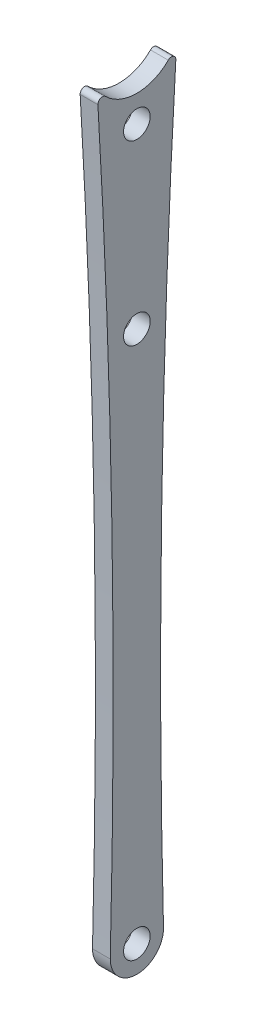
ISO-10303-21;
HEADER;
FILE_DESCRIPTION(('STEP AP214'),'2;1');
FILE_NAME('part.step','',(''),(''),'','','');
FILE_SCHEMA(('AUTOMOTIVE_DESIGN { 1 0 10303 214 1 1 1 1 }'));
ENDSEC;
DATA;
#1=APPLICATION_CONTEXT('core data for automotive mechanical design processes');
#2=APPLICATION_PROTOCOL_DEFINITION('international standard','automotive_design',2000,#1);
#3=PRODUCT_CONTEXT('',#1,'mechanical');
#4=PRODUCT('Part','Part','',(#3));
#5=PRODUCT_RELATED_PRODUCT_CATEGORY('part','',(#4));
#6=PRODUCT_DEFINITION_FORMATION('','',#4);
#7=PRODUCT_DEFINITION_CONTEXT('part definition',#1,'design');
#8=PRODUCT_DEFINITION('design','',#6,#7);
#9=PRODUCT_DEFINITION_SHAPE('','',#8);
#10=(LENGTH_UNIT() NAMED_UNIT(*) SI_UNIT(.MILLI.,.METRE.));
#11=(NAMED_UNIT(*) PLANE_ANGLE_UNIT() SI_UNIT($,.RADIAN.));
#12=(NAMED_UNIT(*) SI_UNIT($,.STERADIAN.) SOLID_ANGLE_UNIT());
#13=UNCERTAINTY_MEASURE_WITH_UNIT(LENGTH_MEASURE(1.E-05),#10,'distance_accuracy_value','');
#14=(GEOMETRIC_REPRESENTATION_CONTEXT(3) GLOBAL_UNCERTAINTY_ASSIGNED_CONTEXT((#13)) GLOBAL_UNIT_ASSIGNED_CONTEXT((#10,
#11,#12)) REPRESENTATION_CONTEXT('',''));
#15=CARTESIAN_POINT('',(0.,0.,0.));
#16=DIRECTION('',(0.,0.,1.));
#17=DIRECTION('',(1.,0.,0.));
#18=AXIS2_PLACEMENT_3D('',#15,#16,#17);
#19=CARTESIAN_POINT('',(2.,54.8167427479074,-503.282905762661));
#20=DIRECTION('',(-1.,0.,0.));
#21=DIRECTION('',(0.,0.,1.));
#22=AXIS2_PLACEMENT_3D('',#19,#20,#21);
#23=PLANE('',#22);
#24=CARTESIAN_POINT('',(2.,25.5201548711849,-1002.67430780997));
#25=DIRECTION('',(-1.,0.,0.));
#26=DIRECTION('',(0.,0.,1.));
#27=AXIS2_PLACEMENT_3D('',#24,#25,#26);
#28=CIRCLE('',#27,1000.);
#29=CARTESIAN_POINT('',(2.,0.,-3.00000000000022));
#30=VERTEX_POINT('',#29);
#31=CARTESIAN_POINT('',(2.,84.0840486777267,-4.39064554647894));
#32=VERTEX_POINT('',#31);
#33=EDGE_CURVE('E155',#30,#32,#28,.T.);
#34=ORIENTED_EDGE('',*,*,#33,.T.);
#35=CARTESIAN_POINT('',(2.,84.11333062463,-3.89150371534719));
#36=DIRECTION('',(1.,0.,0.));
#37=DIRECTION('',(0.,0.,-1.));
#38=AXIS2_PLACEMENT_3D('',#35,#36,#37);
#39=CIRCLE('',#38,0.499999999999999);
#40=CARTESIAN_POINT('',(2.,84.4666642042091,-3.53773065031563));
#41=VERTEX_POINT('',#40);
#42=EDGE_CURVE('E99',#32,#41,#39,.T.);
#43=ORIENTED_EDGE('',*,*,#42,.T.);
#44=CARTESIAN_POINT('',(2.,88.,0.));
#45=DIRECTION('',(-1.,0.,0.));
#46=DIRECTION('',(0.,0.,1.));
#47=AXIS2_PLACEMENT_3D('',#44,#45,#46);
#48=CIRCLE('',#47,5.00000000000001);
#49=CARTESIAN_POINT('',(2.,84.4666642042093,3.53773065031585));
#50=VERTEX_POINT('',#49);
#51=EDGE_CURVE('E114',#41,#50,#48,.T.);
#52=ORIENTED_EDGE('',*,*,#51,.T.);
#53=CARTESIAN_POINT('',(2.,84.11333062463,3.89150371534719));
#54=DIRECTION('',(1.,0.,0.));
#55=DIRECTION('',(0.,0.,1.));
#56=AXIS2_PLACEMENT_3D('',#53,#54,#55);
#57=CIRCLE('',#56,0.499999999999999);
#58=CARTESIAN_POINT('',(2.,84.0840486777263,4.39064554647906));
#59=VERTEX_POINT('',#58);
#60=EDGE_CURVE('E110',#50,#59,#57,.T.);
#61=ORIENTED_EDGE('',*,*,#60,.T.);
#62=CARTESIAN_POINT('',(2.,25.5201548711849,1002.67430780997));
#63=DIRECTION('',(-1.,0.,0.));
#64=DIRECTION('',(0.,0.,-1.));
#65=AXIS2_PLACEMENT_3D('',#62,#63,#64);
#66=CIRCLE('',#65,1000.);
#67=CARTESIAN_POINT('',(2.,0.,3.00000000000022));
#68=VERTEX_POINT('',#67);
#69=EDGE_CURVE('E112',#59,#68,#66,.T.);
#70=ORIENTED_EDGE('',*,*,#69,.T.);
#71=CARTESIAN_POINT('',(2.,0.,0.));
#72=DIRECTION('',(1.,0.,0.));
#73=DIRECTION('',(0.,0.,-1.));
#74=AXIS2_PLACEMENT_3D('',#71,#72,#73);
#75=CIRCLE('',#74,3.00000000000022);
#76=EDGE_CURVE('E62',#68,#30,#75,.T.);
#77=ORIENTED_EDGE('',*,*,#76,.T.);
#78=EDGE_LOOP('',(#34,#43,#52,#61,#70,#77));
#79=FACE_BOUND('',#78,.T.);
#80=CARTESIAN_POINT('',(2.,0.,0.));
#81=DIRECTION('',(1.,0.,0.));
#82=DIRECTION('',(0.,0.,-1.));
#83=AXIS2_PLACEMENT_3D('',#80,#81,#82);
#84=CIRCLE('',#83,1.5);
#85=CARTESIAN_POINT('',(2.,0.,-1.5));
#86=VERTEX_POINT('',#85);
#87=EDGE_CURVE('E138',#86,#86,#84,.T.);
#88=ORIENTED_EDGE('',*,*,#87,.F.);
#89=EDGE_LOOP('',(#88));
#90=FACE_BOUND('',#89,.T.);
#91=CARTESIAN_POINT('',(2.,60.,0.));
#92=DIRECTION('',(1.,0.,0.));
#93=DIRECTION('',(0.,0.,-1.));
#94=AXIS2_PLACEMENT_3D('',#91,#92,#93);
#95=CIRCLE('',#94,1.5);
#96=CARTESIAN_POINT('',(2.,60.,-1.5));
#97=VERTEX_POINT('',#96);
#98=EDGE_CURVE('E215',#97,#97,#95,.T.);
#99=ORIENTED_EDGE('',*,*,#98,.F.);
#100=EDGE_LOOP('',(#99));
#101=FACE_BOUND('',#100,.T.);
#102=CARTESIAN_POINT('',(2.,80.,0.));
#103=DIRECTION('',(1.,0.,0.));
#104=DIRECTION('',(0.,0.,-1.));
#105=AXIS2_PLACEMENT_3D('',#102,#103,#104);
#106=CIRCLE('',#105,1.5);
#107=CARTESIAN_POINT('',(2.,80.,-1.5));
#108=VERTEX_POINT('',#107);
#109=EDGE_CURVE('E203',#108,#108,#106,.T.);
#110=ORIENTED_EDGE('',*,*,#109,.F.);
#111=EDGE_LOOP('',(#110));
#112=FACE_BOUND('',#111,.T.);
#113=ADVANCED_FACE('F44',(#79,#90,#101,#112),#23,.F.);
#114=CARTESIAN_POINT('',(0.,54.8167427479074,-503.282905762661));
#115=DIRECTION('',(-1.,0.,0.));
#116=DIRECTION('',(0.,0.,1.));
#117=AXIS2_PLACEMENT_3D('',#114,#115,#116);
#118=PLANE('',#117);
#119=CARTESIAN_POINT('',(0.,60.,0.));
#120=DIRECTION('',(1.,0.,0.));
#121=DIRECTION('',(0.,0.,-1.));
#122=AXIS2_PLACEMENT_3D('',#119,#120,#121);
#123=CIRCLE('',#122,1.5);
#124=CARTESIAN_POINT('',(0.,60.,-1.5));
#125=VERTEX_POINT('',#124);
#126=EDGE_CURVE('E207',#125,#125,#123,.T.);
#127=ORIENTED_EDGE('',*,*,#126,.T.);
#128=EDGE_LOOP('',(#127));
#129=FACE_BOUND('',#128,.T.);
#130=CARTESIAN_POINT('',(0.,25.5201548711849,-1002.67430780997));
#131=DIRECTION('',(-1.,0.,0.));
#132=DIRECTION('',(0.,0.,1.));
#133=AXIS2_PLACEMENT_3D('',#130,#131,#132);
#134=CIRCLE('',#133,1000.);
#135=CARTESIAN_POINT('',(0.,0.,-3.00000000000022));
#136=VERTEX_POINT('',#135);
#137=CARTESIAN_POINT('',(0.,84.0840486777267,-4.39064554647894));
#138=VERTEX_POINT('',#137);
#139=EDGE_CURVE('E134',#136,#138,#134,.T.);
#140=ORIENTED_EDGE('',*,*,#139,.F.);
#141=CARTESIAN_POINT('',(0.,0.,0.));
#142=DIRECTION('',(1.,0.,0.));
#143=DIRECTION('',(0.,0.,-1.));
#144=AXIS2_PLACEMENT_3D('',#141,#142,#143);
#145=CIRCLE('',#144,3.00000000000022);
#146=CARTESIAN_POINT('',(0.,0.,3.00000000000022));
#147=VERTEX_POINT('',#146);
#148=EDGE_CURVE('E95',#147,#136,#145,.T.);
#149=ORIENTED_EDGE('',*,*,#148,.F.);
#150=CARTESIAN_POINT('',(0.,25.5201548711849,1002.67430780997));
#151=DIRECTION('',(-1.,0.,0.));
#152=DIRECTION('',(0.,0.,-1.));
#153=AXIS2_PLACEMENT_3D('',#150,#151,#152);
#154=CIRCLE('',#153,1000.);
#155=CARTESIAN_POINT('',(0.,84.0840486777263,4.39064554647906));
#156=VERTEX_POINT('',#155);
#157=EDGE_CURVE('E88',#156,#147,#154,.T.);
#158=ORIENTED_EDGE('',*,*,#157,.F.);
#159=CARTESIAN_POINT('',(0.,84.11333062463,3.89150371534719));
#160=DIRECTION('',(1.,0.,0.));
#161=DIRECTION('',(0.,0.,1.));
#162=AXIS2_PLACEMENT_3D('',#159,#160,#161);
#163=CIRCLE('',#162,0.499999999999999);
#164=CARTESIAN_POINT('',(0.,84.4666642042093,3.53773065031585));
#165=VERTEX_POINT('',#164);
#166=EDGE_CURVE('E124',#165,#156,#163,.T.);
#167=ORIENTED_EDGE('',*,*,#166,.F.);
#168=CARTESIAN_POINT('',(0.,88.,0.));
#169=DIRECTION('',(-1.,0.,0.));
#170=DIRECTION('',(0.,0.,1.));
#171=AXIS2_PLACEMENT_3D('',#168,#169,#170);
#172=CIRCLE('',#171,5.00000000000001);
#173=CARTESIAN_POINT('',(0.,84.4666642042091,-3.53773065031563));
#174=VERTEX_POINT('',#173);
#175=EDGE_CURVE('E141',#174,#165,#172,.T.);
#176=ORIENTED_EDGE('',*,*,#175,.F.);
#177=CARTESIAN_POINT('',(0.,84.11333062463,-3.89150371534719));
#178=DIRECTION('',(1.,0.,0.));
#179=DIRECTION('',(0.,0.,-1.));
#180=AXIS2_PLACEMENT_3D('',#177,#178,#179);
#181=CIRCLE('',#180,0.499999999999999);
#182=EDGE_CURVE('E136',#138,#174,#181,.T.);
#183=ORIENTED_EDGE('',*,*,#182,.F.);
#184=EDGE_LOOP('',(#140,#149,#158,#167,#176,#183));
#185=FACE_BOUND('',#184,.T.);
#186=CARTESIAN_POINT('',(0.,0.,0.));
#187=DIRECTION('',(1.,0.,0.));
#188=DIRECTION('',(0.,0.,-1.));
#189=AXIS2_PLACEMENT_3D('',#186,#187,#188);
#190=CIRCLE('',#189,1.5);
#191=CARTESIAN_POINT('',(0.,0.,-1.5));
#192=VERTEX_POINT('',#191);
#193=EDGE_CURVE('E216',#192,#192,#190,.T.);
#194=ORIENTED_EDGE('',*,*,#193,.T.);
#195=EDGE_LOOP('',(#194));
#196=FACE_BOUND('',#195,.T.);
#197=CARTESIAN_POINT('',(0.,80.,0.));
#198=DIRECTION('',(1.,0.,0.));
#199=DIRECTION('',(0.,0.,-1.));
#200=AXIS2_PLACEMENT_3D('',#197,#198,#199);
#201=CIRCLE('',#200,1.5);
#202=CARTESIAN_POINT('',(0.,80.,-1.5));
#203=VERTEX_POINT('',#202);
#204=EDGE_CURVE('E204',#203,#203,#201,.T.);
#205=ORIENTED_EDGE('',*,*,#204,.T.);
#206=EDGE_LOOP('',(#205));
#207=FACE_BOUND('',#206,.T.);
#208=ADVANCED_FACE('F164',(#129,#185,#196,#207),#118,.T.);
#209=CARTESIAN_POINT('',(2.,25.5201548711849,-1002.67430780997));
#210=DIRECTION('',(-1.,0.,0.));
#211=DIRECTION('',(0.,0.,1.));
#212=AXIS2_PLACEMENT_3D('',#209,#210,#211);
#213=CYLINDRICAL_SURFACE('',#212,1000.);
#214=ORIENTED_EDGE('',*,*,#139,.T.);
#215=DIRECTION('',(-1.,0.,0.));
#216=VECTOR('',#215,1.);
#217=CARTESIAN_POINT('',(2.,84.0840486777267,-4.39064554647894));
#218=LINE('',#217,#216);
#219=EDGE_CURVE('E11',#32,#138,#218,.T.);
#220=ORIENTED_EDGE('',*,*,#219,.F.);
#221=ORIENTED_EDGE('',*,*,#33,.F.);
#222=DIRECTION('',(-1.,0.,0.));
#223=VECTOR('',#222,1.);
#224=CARTESIAN_POINT('',(2.,0.,-3.00000000000022));
#225=LINE('',#224,#223);
#226=EDGE_CURVE('E131',#30,#136,#225,.T.);
#227=ORIENTED_EDGE('',*,*,#226,.T.);
#228=EDGE_LOOP('',(#214,#220,#221,#227));
#229=FACE_BOUND('',#228,.T.);
#230=ADVANCED_FACE('F50',(#229),#213,.F.);
#231=CARTESIAN_POINT('',(2.,84.11333062463,-3.89150371534719));
#232=DIRECTION('',(-1.,0.,0.));
#233=DIRECTION('',(0.,0.,1.));
#234=AXIS2_PLACEMENT_3D('',#231,#232,#233);
#235=CYLINDRICAL_SURFACE('',#234,0.499999999999999);
#236=ORIENTED_EDGE('',*,*,#182,.T.);
#237=DIRECTION('',(-1.,0.,0.));
#238=VECTOR('',#237,1.);
#239=CARTESIAN_POINT('',(2.,84.4666642042091,-3.53773065031563));
#240=LINE('',#239,#238);
#241=EDGE_CURVE('E54',#41,#174,#240,.T.);
#242=ORIENTED_EDGE('',*,*,#241,.F.);
#243=ORIENTED_EDGE('',*,*,#42,.F.);
#244=ORIENTED_EDGE('',*,*,#219,.T.);
#245=EDGE_LOOP('',(#236,#242,#243,#244));
#246=FACE_BOUND('',#245,.T.);
#247=ADVANCED_FACE('F277',(#246),#235,.T.);
#248=CARTESIAN_POINT('',(2.,88.,0.));
#249=DIRECTION('',(-1.,0.,0.));
#250=DIRECTION('',(0.,0.,1.));
#251=AXIS2_PLACEMENT_3D('',#248,#249,#250);
#252=CYLINDRICAL_SURFACE('',#251,5.00000000000001);
#253=ORIENTED_EDGE('',*,*,#175,.T.);
#254=DIRECTION('',(-1.,0.,0.));
#255=VECTOR('',#254,1.);
#256=CARTESIAN_POINT('',(2.,84.4666642042093,3.53773065031585));
#257=LINE('',#256,#255);
#258=EDGE_CURVE('E121',#50,#165,#257,.T.);
#259=ORIENTED_EDGE('',*,*,#258,.F.);
#260=ORIENTED_EDGE('',*,*,#51,.F.);
#261=ORIENTED_EDGE('',*,*,#241,.T.);
#262=EDGE_LOOP('',(#253,#259,#260,#261));
#263=FACE_BOUND('',#262,.T.);
#264=ADVANCED_FACE('F165',(#263),#252,.F.);
#265=CARTESIAN_POINT('',(2.,84.11333062463,3.89150371534719));
#266=DIRECTION('',(-1.,0.,0.));
#267=DIRECTION('',(0.,0.,1.));
#268=AXIS2_PLACEMENT_3D('',#265,#266,#267);
#269=CYLINDRICAL_SURFACE('',#268,0.499999999999999);
#270=ORIENTED_EDGE('',*,*,#166,.T.);
#271=DIRECTION('',(-1.,0.,0.));
#272=VECTOR('',#271,1.);
#273=CARTESIAN_POINT('',(2.,84.0840486777263,4.39064554647906));
#274=LINE('',#273,#272);
#275=EDGE_CURVE('E118',#59,#156,#274,.T.);
#276=ORIENTED_EDGE('',*,*,#275,.F.);
#277=ORIENTED_EDGE('',*,*,#60,.F.);
#278=ORIENTED_EDGE('',*,*,#258,.T.);
#279=EDGE_LOOP('',(#270,#276,#277,#278));
#280=FACE_BOUND('',#279,.T.);
#281=ADVANCED_FACE('F119',(#280),#269,.T.);
#282=CARTESIAN_POINT('',(2.,25.5201548711849,1002.67430780997));
#283=DIRECTION('',(-1.,0.,0.));
#284=DIRECTION('',(0.,0.,1.));
#285=AXIS2_PLACEMENT_3D('',#282,#283,#284);
#286=CYLINDRICAL_SURFACE('',#285,1000.);
#287=ORIENTED_EDGE('',*,*,#157,.T.);
#288=DIRECTION('',(-1.,0.,0.));
#289=VECTOR('',#288,1.);
#290=CARTESIAN_POINT('',(2.,0.,3.00000000000022));
#291=LINE('',#290,#289);
#292=EDGE_CURVE('E123',#68,#147,#291,.T.);
#293=ORIENTED_EDGE('',*,*,#292,.F.);
#294=ORIENTED_EDGE('',*,*,#69,.F.);
#295=ORIENTED_EDGE('',*,*,#275,.T.);
#296=EDGE_LOOP('',(#287,#293,#294,#295));
#297=FACE_BOUND('',#296,.T.);
#298=ADVANCED_FACE('F130',(#297),#286,.F.);
#299=CARTESIAN_POINT('',(2.,0.,0.));
#300=DIRECTION('',(-1.,0.,0.));
#301=DIRECTION('',(0.,0.,1.));
#302=AXIS2_PLACEMENT_3D('',#299,#300,#301);
#303=CYLINDRICAL_SURFACE('',#302,3.00000000000022);
#304=ORIENTED_EDGE('',*,*,#148,.T.);
#305=ORIENTED_EDGE('',*,*,#226,.F.);
#306=ORIENTED_EDGE('',*,*,#76,.F.);
#307=ORIENTED_EDGE('',*,*,#292,.T.);
#308=EDGE_LOOP('',(#304,#305,#306,#307));
#309=FACE_BOUND('',#308,.T.);
#310=ADVANCED_FACE('F168',(#309),#303,.T.);
#311=CARTESIAN_POINT('',(2.,0.,0.));
#312=DIRECTION('',(-1.,0.,0.));
#313=DIRECTION('',(0.,0.,1.));
#314=AXIS2_PLACEMENT_3D('',#311,#312,#313);
#315=CYLINDRICAL_SURFACE('',#314,1.5);
#316=ORIENTED_EDGE('',*,*,#87,.T.);
#317=EDGE_LOOP('',(#316));
#318=FACE_BOUND('',#317,.T.);
#319=ORIENTED_EDGE('',*,*,#193,.F.);
#320=EDGE_LOOP('',(#319));
#321=FACE_BOUND('',#320,.T.);
#322=ADVANCED_FACE('F175',(#318,#321),#315,.F.);
#323=CARTESIAN_POINT('',(2.,60.,0.));
#324=DIRECTION('',(-1.,0.,0.));
#325=DIRECTION('',(0.,0.,1.));
#326=AXIS2_PLACEMENT_3D('',#323,#324,#325);
#327=CYLINDRICAL_SURFACE('',#326,1.5);
#328=ORIENTED_EDGE('',*,*,#98,.T.);
#329=EDGE_LOOP('',(#328));
#330=FACE_BOUND('',#329,.T.);
#331=ORIENTED_EDGE('',*,*,#126,.F.);
#332=EDGE_LOOP('',(#331));
#333=FACE_BOUND('',#332,.T.);
#334=ADVANCED_FACE('F180',(#330,#333),#327,.F.);
#335=CARTESIAN_POINT('',(2.,80.,0.));
#336=DIRECTION('',(-1.,0.,0.));
#337=DIRECTION('',(0.,0.,1.));
#338=AXIS2_PLACEMENT_3D('',#335,#336,#337);
#339=CYLINDRICAL_SURFACE('',#338,1.5);
#340=ORIENTED_EDGE('',*,*,#109,.T.);
#341=EDGE_LOOP('',(#340));
#342=FACE_BOUND('',#341,.T.);
#343=ORIENTED_EDGE('',*,*,#204,.F.);
#344=EDGE_LOOP('',(#343));
#345=FACE_BOUND('',#344,.T.);
#346=ADVANCED_FACE('F194',(#342,#345),#339,.F.);
#347=CLOSED_SHELL('',(#113,#208,#230,#247,#264,#281,#298,#310,#322,#334,#346));
#348=MANIFOLD_SOLID_BREP('B2',#347);
#349=ADVANCED_BREP_SHAPE_REPRESENTATION('',(#18,#348),#14);
#350=SHAPE_DEFINITION_REPRESENTATION(#9,#349);
ENDSEC;
END-ISO-10303-21;
